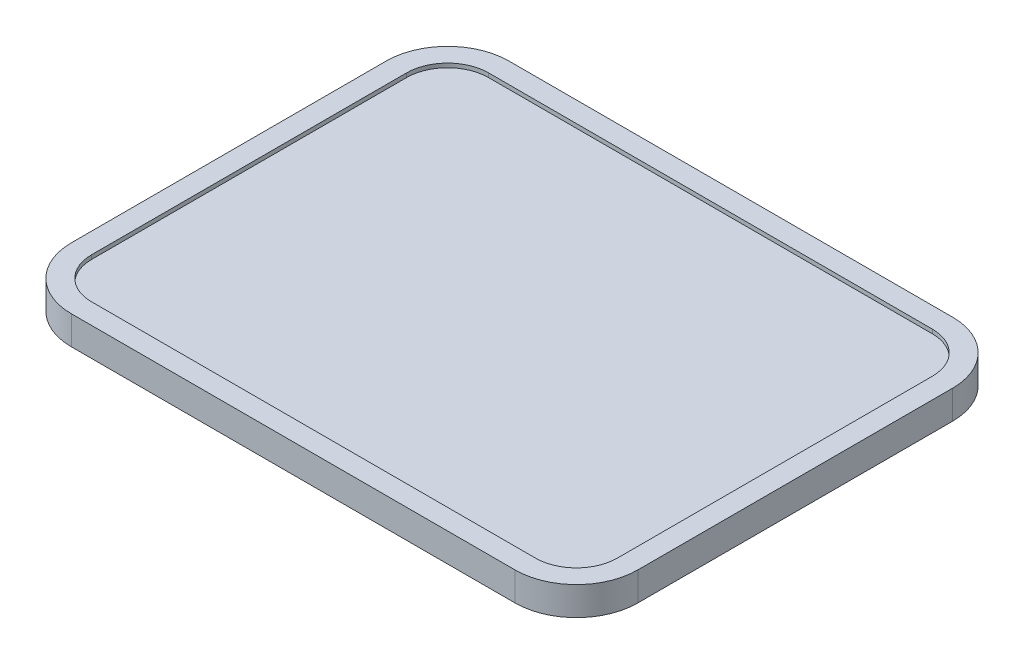
ISO-10303-21;
HEADER;
FILE_DESCRIPTION(('STEP AP214'),'2;1');
FILE_NAME('part.step','',(''),(''),'','','');
FILE_SCHEMA(('AUTOMOTIVE_DESIGN { 1 0 10303 214 1 1 1 1 }'));
ENDSEC;
DATA;
#1=APPLICATION_CONTEXT('core data for automotive mechanical design processes');
#2=APPLICATION_PROTOCOL_DEFINITION('international standard','automotive_design',2000,#1);
#3=PRODUCT_CONTEXT('',#1,'mechanical');
#4=PRODUCT('Part','Part','',(#3));
#5=PRODUCT_RELATED_PRODUCT_CATEGORY('part','',(#4));
#6=PRODUCT_DEFINITION_FORMATION('','',#4);
#7=PRODUCT_DEFINITION_CONTEXT('part definition',#1,'design');
#8=PRODUCT_DEFINITION('design','',#6,#7);
#9=PRODUCT_DEFINITION_SHAPE('','',#8);
#10=(LENGTH_UNIT() NAMED_UNIT(*) SI_UNIT(.MILLI.,.METRE.));
#11=(NAMED_UNIT(*) PLANE_ANGLE_UNIT() SI_UNIT($,.RADIAN.));
#12=(NAMED_UNIT(*) SI_UNIT($,.STERADIAN.) SOLID_ANGLE_UNIT());
#13=UNCERTAINTY_MEASURE_WITH_UNIT(LENGTH_MEASURE(1.E-05),#10,'distance_accuracy_value','');
#14=(GEOMETRIC_REPRESENTATION_CONTEXT(3) GLOBAL_UNCERTAINTY_ASSIGNED_CONTEXT((#13)) GLOBAL_UNIT_ASSIGNED_CONTEXT((#10,
#11,#12)) REPRESENTATION_CONTEXT('',''));
#15=CARTESIAN_POINT('',(0.,0.,0.));
#16=DIRECTION('',(0.,0.,1.));
#17=DIRECTION('',(1.,0.,0.));
#18=AXIS2_PLACEMENT_3D('',#15,#16,#17);
#19=CARTESIAN_POINT('',(138.5,14.,107.));
#20=DIRECTION('',(-1.,0.,0.));
#21=DIRECTION('',(0.,0.,1.));
#22=AXIS2_PLACEMENT_3D('',#19,#20,#21);
#23=PLANE('',#22);
#24=DIRECTION('',(0.,0.,-1.));
#25=VECTOR('',#24,1.);
#26=CARTESIAN_POINT('',(138.5,0.,107.));
#27=LINE('',#26,#25);
#28=CARTESIAN_POINT('',(138.5,0.,77.));
#29=VERTEX_POINT('',#28);
#30=CARTESIAN_POINT('',(138.5,0.,-77.));
#31=VERTEX_POINT('',#30);
#32=EDGE_CURVE('E377',#29,#31,#27,.T.);
#33=ORIENTED_EDGE('',*,*,#32,.T.);
#34=DIRECTION('',(0.,-1.,0.));
#35=VECTOR('',#34,1.);
#36=CARTESIAN_POINT('',(138.5,14.,-77.));
#37=LINE('',#36,#35);
#38=CARTESIAN_POINT('',(138.5,14.,-77.));
#39=VERTEX_POINT('',#38);
#40=EDGE_CURVE('E11',#31,#39,#37,.F.);
#41=ORIENTED_EDGE('',*,*,#40,.T.);
#42=DIRECTION('',(0.,0.,-1.));
#43=VECTOR('',#42,1.);
#44=CARTESIAN_POINT('',(138.5,14.,107.));
#45=LINE('',#44,#43);
#46=CARTESIAN_POINT('',(138.5,14.,77.));
#47=VERTEX_POINT('',#46);
#48=EDGE_CURVE('E391',#47,#39,#45,.T.);
#49=ORIENTED_EDGE('',*,*,#48,.F.);
#50=DIRECTION('',(0.,-1.,0.));
#51=VECTOR('',#50,1.);
#52=CARTESIAN_POINT('',(138.5,14.,77.));
#53=LINE('',#52,#51);
#54=EDGE_CURVE('E50',#47,#29,#53,.T.);
#55=ORIENTED_EDGE('',*,*,#54,.T.);
#56=EDGE_LOOP('',(#33,#41,#49,#55));
#57=FACE_BOUND('',#56,.T.);
#58=ADVANCED_FACE('F42',(#57),#23,.F.);
#59=CARTESIAN_POINT('',(-138.5,14.,-107.));
#60=DIRECTION('',(0.,0.,1.));
#61=DIRECTION('',(1.,0.,0.));
#62=AXIS2_PLACEMENT_3D('',#59,#60,#61);
#63=PLANE('',#62);
#64=DIRECTION('',(-1.,0.,0.));
#65=VECTOR('',#64,1.);
#66=CARTESIAN_POINT('',(-138.5,0.,-107.));
#67=LINE('',#66,#65);
#68=CARTESIAN_POINT('',(108.5,0.,-107.));
#69=VERTEX_POINT('',#68);
#70=CARTESIAN_POINT('',(-108.5,0.,-107.));
#71=VERTEX_POINT('',#70);
#72=EDGE_CURVE('E407',#69,#71,#67,.T.);
#73=ORIENTED_EDGE('',*,*,#72,.T.);
#74=DIRECTION('',(0.,-1.,0.));
#75=VECTOR('',#74,1.);
#76=CARTESIAN_POINT('',(-108.5,14.,-107.));
#77=LINE('',#76,#75);
#78=CARTESIAN_POINT('',(-108.5,14.,-107.));
#79=VERTEX_POINT('',#78);
#80=EDGE_CURVE('E443',#71,#79,#77,.F.);
#81=ORIENTED_EDGE('',*,*,#80,.T.);
#82=DIRECTION('',(-1.,0.,0.));
#83=VECTOR('',#82,1.);
#84=CARTESIAN_POINT('',(-138.5,14.,-107.));
#85=LINE('',#84,#83);
#86=CARTESIAN_POINT('',(108.5,14.,-107.));
#87=VERTEX_POINT('',#86);
#88=EDGE_CURVE('E394',#87,#79,#85,.T.);
#89=ORIENTED_EDGE('',*,*,#88,.F.);
#90=DIRECTION('',(0.,-1.,0.));
#91=VECTOR('',#90,1.);
#92=CARTESIAN_POINT('',(108.5,14.,-107.));
#93=LINE('',#92,#91);
#94=EDGE_CURVE('E440',#87,#69,#93,.T.);
#95=ORIENTED_EDGE('',*,*,#94,.T.);
#96=EDGE_LOOP('',(#73,#81,#89,#95));
#97=FACE_BOUND('',#96,.T.);
#98=ADVANCED_FACE('F462',(#97),#63,.F.);
#99=CARTESIAN_POINT('',(-138.5,14.,107.));
#100=DIRECTION('',(1.,0.,0.));
#101=DIRECTION('',(0.,0.,-1.));
#102=AXIS2_PLACEMENT_3D('',#99,#100,#101);
#103=PLANE('',#102);
#104=DIRECTION('',(0.,0.,1.));
#105=VECTOR('',#104,1.);
#106=CARTESIAN_POINT('',(-138.5,0.,107.));
#107=LINE('',#106,#105);
#108=CARTESIAN_POINT('',(-138.5,0.,-77.));
#109=VERTEX_POINT('',#108);
#110=CARTESIAN_POINT('',(-138.5,0.,77.));
#111=VERTEX_POINT('',#110);
#112=EDGE_CURVE('E410',#109,#111,#107,.T.);
#113=ORIENTED_EDGE('',*,*,#112,.T.);
#114=DIRECTION('',(0.,-1.,0.));
#115=VECTOR('',#114,1.);
#116=CARTESIAN_POINT('',(-138.5,14.,77.));
#117=LINE('',#116,#115);
#118=CARTESIAN_POINT('',(-138.5,14.,77.));
#119=VERTEX_POINT('',#118);
#120=EDGE_CURVE('E430',#111,#119,#117,.F.);
#121=ORIENTED_EDGE('',*,*,#120,.T.);
#122=DIRECTION('',(0.,0.,1.));
#123=VECTOR('',#122,1.);
#124=CARTESIAN_POINT('',(-138.5,14.,107.));
#125=LINE('',#124,#123);
#126=CARTESIAN_POINT('',(-138.5,14.,-77.));
#127=VERTEX_POINT('',#126);
#128=EDGE_CURVE('E398',#127,#119,#125,.T.);
#129=ORIENTED_EDGE('',*,*,#128,.F.);
#130=DIRECTION('',(0.,-1.,0.));
#131=VECTOR('',#130,1.);
#132=CARTESIAN_POINT('',(-138.5,14.,-77.));
#133=LINE('',#132,#131);
#134=EDGE_CURVE('E427',#127,#109,#133,.T.);
#135=ORIENTED_EDGE('',*,*,#134,.T.);
#136=EDGE_LOOP('',(#113,#121,#129,#135));
#137=FACE_BOUND('',#136,.T.);
#138=ADVANCED_FACE('F473',(#137),#103,.F.);
#139=CARTESIAN_POINT('',(-138.5,14.,107.));
#140=DIRECTION('',(0.,0.,-1.));
#141=DIRECTION('',(-1.,0.,0.));
#142=AXIS2_PLACEMENT_3D('',#139,#140,#141);
#143=PLANE('',#142);
#144=DIRECTION('',(1.,0.,0.));
#145=VECTOR('',#144,1.);
#146=CARTESIAN_POINT('',(-138.5,14.,107.));
#147=LINE('',#146,#145);
#148=CARTESIAN_POINT('',(-108.5,14.,107.));
#149=VERTEX_POINT('',#148);
#150=CARTESIAN_POINT('',(108.5,14.,107.));
#151=VERTEX_POINT('',#150);
#152=EDGE_CURVE('E401',#149,#151,#147,.T.);
#153=ORIENTED_EDGE('',*,*,#152,.F.);
#154=DIRECTION('',(0.,-1.,0.));
#155=VECTOR('',#154,1.);
#156=CARTESIAN_POINT('',(-108.5,14.,107.));
#157=LINE('',#156,#155);
#158=CARTESIAN_POINT('',(-108.5,0.,107.));
#159=VERTEX_POINT('',#158);
#160=EDGE_CURVE('E416',#149,#159,#157,.T.);
#161=ORIENTED_EDGE('',*,*,#160,.T.);
#162=DIRECTION('',(1.,0.,0.));
#163=VECTOR('',#162,1.);
#164=CARTESIAN_POINT('',(-138.5,0.,107.));
#165=LINE('',#164,#163);
#166=CARTESIAN_POINT('',(108.5,0.,107.));
#167=VERTEX_POINT('',#166);
#168=EDGE_CURVE('E395',#159,#167,#165,.T.);
#169=ORIENTED_EDGE('',*,*,#168,.T.);
#170=DIRECTION('',(0.,-1.,0.));
#171=VECTOR('',#170,1.);
#172=CARTESIAN_POINT('',(108.5,14.,107.));
#173=LINE('',#172,#171);
#174=EDGE_CURVE('E404',#167,#151,#173,.F.);
#175=ORIENTED_EDGE('',*,*,#174,.T.);
#176=EDGE_LOOP('',(#153,#161,#169,#175));
#177=FACE_BOUND('',#176,.T.);
#178=ADVANCED_FACE('F481',(#177),#143,.F.);
#179=CARTESIAN_POINT('',(0.,14.,0.));
#180=DIRECTION('',(0.,-1.,0.));
#181=DIRECTION('',(0.,0.,-1.));
#182=AXIS2_PLACEMENT_3D('',#179,#180,#181);
#183=PLANE('',#182);
#184=DIRECTION('',(0.,0.,1.));
#185=VECTOR('',#184,1.);
#186=CARTESIAN_POINT('',(-128.5,14.,-77.));
#187=LINE('',#186,#185);
#188=CARTESIAN_POINT('',(-128.5,14.,-77.));
#189=VERTEX_POINT('',#188);
#190=CARTESIAN_POINT('',(-128.5,14.,77.));
#191=VERTEX_POINT('',#190);
#192=EDGE_CURVE('E355',#189,#191,#187,.T.);
#193=ORIENTED_EDGE('',*,*,#192,.F.);
#194=CARTESIAN_POINT('',(-108.5,14.,-77.));
#195=DIRECTION('',(0.,1.,0.));
#196=DIRECTION('',(0.,0.,1.));
#197=AXIS2_PLACEMENT_3D('',#194,#195,#196);
#198=CIRCLE('',#197,20.);
#199=CARTESIAN_POINT('',(-108.5,14.,-97.));
#200=VERTEX_POINT('',#199);
#201=EDGE_CURVE('E65',#200,#189,#198,.T.);
#202=ORIENTED_EDGE('',*,*,#201,.F.);
#203=DIRECTION('',(-1.,0.,0.));
#204=VECTOR('',#203,1.);
#205=CARTESIAN_POINT('',(108.5,14.,-97.));
#206=LINE('',#205,#204);
#207=CARTESIAN_POINT('',(108.5,14.,-97.));
#208=VERTEX_POINT('',#207);
#209=EDGE_CURVE('E332',#208,#200,#206,.T.);
#210=ORIENTED_EDGE('',*,*,#209,.F.);
#211=CARTESIAN_POINT('',(108.5,14.,-77.));
#212=DIRECTION('',(0.,1.,0.));
#213=DIRECTION('',(0.,0.,1.));
#214=AXIS2_PLACEMENT_3D('',#211,#212,#213);
#215=CIRCLE('',#214,20.);
#216=CARTESIAN_POINT('',(128.5,14.,-77.));
#217=VERTEX_POINT('',#216);
#218=EDGE_CURVE('E370',#217,#208,#215,.T.);
#219=ORIENTED_EDGE('',*,*,#218,.F.);
#220=DIRECTION('',(0.,0.,-1.));
#221=VECTOR('',#220,1.);
#222=CARTESIAN_POINT('',(128.5,14.,77.));
#223=LINE('',#222,#221);
#224=CARTESIAN_POINT('',(128.5,14.,77.));
#225=VERTEX_POINT('',#224);
#226=EDGE_CURVE('E367',#225,#217,#223,.T.);
#227=ORIENTED_EDGE('',*,*,#226,.F.);
#228=CARTESIAN_POINT('',(108.5,14.,77.));
#229=DIRECTION('',(0.,1.,0.));
#230=DIRECTION('',(0.,0.,1.));
#231=AXIS2_PLACEMENT_3D('',#228,#229,#230);
#232=CIRCLE('',#231,20.);
#233=CARTESIAN_POINT('',(108.5,14.,97.));
#234=VERTEX_POINT('',#233);
#235=EDGE_CURVE('E364',#234,#225,#232,.T.);
#236=ORIENTED_EDGE('',*,*,#235,.F.);
#237=DIRECTION('',(1.,0.,0.));
#238=VECTOR('',#237,1.);
#239=CARTESIAN_POINT('',(-108.5,14.,97.));
#240=LINE('',#239,#238);
#241=CARTESIAN_POINT('',(-108.5,14.,97.));
#242=VERTEX_POINT('',#241);
#243=EDGE_CURVE('E361',#242,#234,#240,.T.);
#244=ORIENTED_EDGE('',*,*,#243,.F.);
#245=CARTESIAN_POINT('',(-108.5,14.,77.));
#246=DIRECTION('',(0.,1.,0.));
#247=DIRECTION('',(0.,0.,1.));
#248=AXIS2_PLACEMENT_3D('',#245,#246,#247);
#249=CIRCLE('',#248,20.);
#250=EDGE_CURVE('E358',#191,#242,#249,.T.);
#251=ORIENTED_EDGE('',*,*,#250,.F.);
#252=EDGE_LOOP('',(#193,#202,#210,#219,#227,#236,#244,#251));
#253=FACE_BOUND('',#252,.T.);
#254=ORIENTED_EDGE('',*,*,#128,.T.);
#255=CARTESIAN_POINT('',(-108.5,14.,77.));
#256=DIRECTION('',(0.,-1.,0.));
#257=DIRECTION('',(0.,0.,-1.));
#258=AXIS2_PLACEMENT_3D('',#255,#256,#257);
#259=CIRCLE('',#258,30.);
#260=EDGE_CURVE('E438',#119,#149,#259,.F.);
#261=ORIENTED_EDGE('',*,*,#260,.T.);
#262=ORIENTED_EDGE('',*,*,#152,.T.);
#263=CARTESIAN_POINT('',(108.5,14.,77.));
#264=DIRECTION('',(0.,-1.,0.));
#265=DIRECTION('',(0.,0.,-1.));
#266=AXIS2_PLACEMENT_3D('',#263,#264,#265);
#267=CIRCLE('',#266,30.);
#268=EDGE_CURVE('E432',#151,#47,#267,.F.);
#269=ORIENTED_EDGE('',*,*,#268,.T.);
#270=ORIENTED_EDGE('',*,*,#48,.T.);
#271=CARTESIAN_POINT('',(108.5,14.,-77.));
#272=DIRECTION('',(0.,-1.,0.));
#273=DIRECTION('',(0.,0.,-1.));
#274=AXIS2_PLACEMENT_3D('',#271,#272,#273);
#275=CIRCLE('',#274,30.);
#276=EDGE_CURVE('E434',#39,#87,#275,.F.);
#277=ORIENTED_EDGE('',*,*,#276,.T.);
#278=ORIENTED_EDGE('',*,*,#88,.T.);
#279=CARTESIAN_POINT('',(-108.5,14.,-77.));
#280=DIRECTION('',(0.,-1.,0.));
#281=DIRECTION('',(0.,0.,-1.));
#282=AXIS2_PLACEMENT_3D('',#279,#280,#281);
#283=CIRCLE('',#282,30.);
#284=EDGE_CURVE('E436',#79,#127,#283,.F.);
#285=ORIENTED_EDGE('',*,*,#284,.T.);
#286=EDGE_LOOP('',(#254,#261,#262,#269,#270,#277,#278,#285));
#287=FACE_BOUND('',#286,.T.);
#288=ADVANCED_FACE('F466',(#253,#287),#183,.F.);
#289=CARTESIAN_POINT('',(0.,0.,0.));
#290=DIRECTION('',(0.,-1.,0.));
#291=DIRECTION('',(0.,0.,-1.));
#292=AXIS2_PLACEMENT_3D('',#289,#290,#291);
#293=PLANE('',#292);
#294=DIRECTION('',(-1.,0.,0.));
#295=VECTOR('',#294,1.);
#296=CARTESIAN_POINT('',(128.5,0.,77.));
#297=LINE('',#296,#295);
#298=CARTESIAN_POINT('',(128.5,0.,77.));
#299=VERTEX_POINT('',#298);
#300=CARTESIAN_POINT('',(104.5,0.,77.));
#301=VERTEX_POINT('',#300);
#302=EDGE_CURVE('E57',#299,#301,#297,.T.);
#303=ORIENTED_EDGE('',*,*,#302,.F.);
#304=DIRECTION('',(0.,0.,1.));
#305=VECTOR('',#304,1.);
#306=CARTESIAN_POINT('',(128.5,0.,0.));
#307=LINE('',#306,#305);
#308=CARTESIAN_POINT('',(128.5,0.,-77.));
#309=VERTEX_POINT('',#308);
#310=EDGE_CURVE('E247',#309,#299,#307,.T.);
#311=ORIENTED_EDGE('',*,*,#310,.F.);
#312=DIRECTION('',(1.,0.,0.));
#313=VECTOR('',#312,1.);
#314=CARTESIAN_POINT('',(128.5,0.,-77.));
#315=LINE('',#314,#313);
#316=CARTESIAN_POINT('',(104.5,0.,-77.));
#317=VERTEX_POINT('',#316);
#318=EDGE_CURVE('E250',#317,#309,#315,.T.);
#319=ORIENTED_EDGE('',*,*,#318,.F.);
#320=DIRECTION('',(0.,0.,1.));
#321=VECTOR('',#320,1.);
#322=CARTESIAN_POINT('',(104.5,0.,-77.));
#323=LINE('',#322,#321);
#324=CARTESIAN_POINT('',(104.5,0.,-96.));
#325=VERTEX_POINT('',#324);
#326=EDGE_CURVE('E302',#325,#317,#323,.T.);
#327=ORIENTED_EDGE('',*,*,#326,.F.);
#328=DIRECTION('',(1.,0.,0.));
#329=VECTOR('',#328,1.);
#330=CARTESIAN_POINT('',(-104.5,0.,-96.));
#331=LINE('',#330,#329);
#332=CARTESIAN_POINT('',(-104.5,0.,-96.));
#333=VERTEX_POINT('',#332);
#334=EDGE_CURVE('E299',#333,#325,#331,.T.);
#335=ORIENTED_EDGE('',*,*,#334,.F.);
#336=DIRECTION('',(0.,0.,-1.));
#337=VECTOR('',#336,1.);
#338=CARTESIAN_POINT('',(-104.5,0.,-77.));
#339=LINE('',#338,#337);
#340=CARTESIAN_POINT('',(-104.5,0.,-77.));
#341=VERTEX_POINT('',#340);
#342=EDGE_CURVE('E296',#341,#333,#339,.T.);
#343=ORIENTED_EDGE('',*,*,#342,.F.);
#344=DIRECTION('',(1.,0.,0.));
#345=VECTOR('',#344,1.);
#346=CARTESIAN_POINT('',(-128.5,0.,-77.));
#347=LINE('',#346,#345);
#348=CARTESIAN_POINT('',(-128.5,0.,-77.));
#349=VERTEX_POINT('',#348);
#350=EDGE_CURVE('E293',#349,#341,#347,.T.);
#351=ORIENTED_EDGE('',*,*,#350,.F.);
#352=DIRECTION('',(0.,0.,-1.));
#353=VECTOR('',#352,1.);
#354=CARTESIAN_POINT('',(-128.5,0.,-77.));
#355=LINE('',#354,#353);
#356=CARTESIAN_POINT('',(-128.5,0.,77.));
#357=VERTEX_POINT('',#356);
#358=EDGE_CURVE('E290',#357,#349,#355,.T.);
#359=ORIENTED_EDGE('',*,*,#358,.F.);
#360=DIRECTION('',(-1.,0.,0.));
#361=VECTOR('',#360,1.);
#362=CARTESIAN_POINT('',(-128.5,0.,77.));
#363=LINE('',#362,#361);
#364=CARTESIAN_POINT('',(-104.5,0.,77.));
#365=VERTEX_POINT('',#364);
#366=EDGE_CURVE('E287',#365,#357,#363,.T.);
#367=ORIENTED_EDGE('',*,*,#366,.F.);
#368=DIRECTION('',(0.,0.,-1.));
#369=VECTOR('',#368,1.);
#370=CARTESIAN_POINT('',(-104.5,0.,77.));
#371=LINE('',#370,#369);
#372=CARTESIAN_POINT('',(-104.5,0.,96.));
#373=VERTEX_POINT('',#372);
#374=EDGE_CURVE('E284',#373,#365,#371,.T.);
#375=ORIENTED_EDGE('',*,*,#374,.F.);
#376=DIRECTION('',(-1.,0.,0.));
#377=VECTOR('',#376,1.);
#378=CARTESIAN_POINT('',(-104.5,0.,96.));
#379=LINE('',#378,#377);
#380=CARTESIAN_POINT('',(104.5,0.,96.));
#381=VERTEX_POINT('',#380);
#382=EDGE_CURVE('E281',#381,#373,#379,.T.);
#383=ORIENTED_EDGE('',*,*,#382,.F.);
#384=DIRECTION('',(0.,0.,1.));
#385=VECTOR('',#384,1.);
#386=CARTESIAN_POINT('',(104.5,0.,77.));
#387=LINE('',#386,#385);
#388=EDGE_CURVE('E279',#301,#381,#387,.T.);
#389=ORIENTED_EDGE('',*,*,#388,.F.);
#390=EDGE_LOOP('',(#303,#311,#319,#327,#335,#343,#351,#359,#367,#375,#383,#389));
#391=FACE_BOUND('',#390,.T.);
#392=ORIENTED_EDGE('',*,*,#168,.F.);
#393=CARTESIAN_POINT('',(-108.5,0.,77.));
#394=DIRECTION('',(0.,-1.,0.));
#395=DIRECTION('',(0.,0.,-1.));
#396=AXIS2_PLACEMENT_3D('',#393,#394,#395);
#397=CIRCLE('',#396,30.);
#398=EDGE_CURVE('E425',#159,#111,#397,.T.);
#399=ORIENTED_EDGE('',*,*,#398,.T.);
#400=ORIENTED_EDGE('',*,*,#112,.F.);
#401=CARTESIAN_POINT('',(-108.5,0.,-77.));
#402=DIRECTION('',(0.,-1.,0.));
#403=DIRECTION('',(0.,0.,-1.));
#404=AXIS2_PLACEMENT_3D('',#401,#402,#403);
#405=CIRCLE('',#404,30.);
#406=EDGE_CURVE('E423',#109,#71,#405,.T.);
#407=ORIENTED_EDGE('',*,*,#406,.T.);
#408=ORIENTED_EDGE('',*,*,#72,.F.);
#409=CARTESIAN_POINT('',(108.5,0.,-77.));
#410=DIRECTION('',(0.,-1.,0.));
#411=DIRECTION('',(0.,0.,-1.));
#412=AXIS2_PLACEMENT_3D('',#409,#410,#411);
#413=CIRCLE('',#412,30.);
#414=EDGE_CURVE('E421',#69,#31,#413,.T.);
#415=ORIENTED_EDGE('',*,*,#414,.T.);
#416=ORIENTED_EDGE('',*,*,#32,.F.);
#417=CARTESIAN_POINT('',(108.5,0.,77.));
#418=DIRECTION('',(0.,-1.,0.));
#419=DIRECTION('',(0.,0.,-1.));
#420=AXIS2_PLACEMENT_3D('',#417,#418,#419);
#421=CIRCLE('',#420,30.);
#422=EDGE_CURVE('E419',#29,#167,#421,.T.);
#423=ORIENTED_EDGE('',*,*,#422,.T.);
#424=EDGE_LOOP('',(#392,#399,#400,#407,#408,#415,#416,#423));
#425=FACE_BOUND('',#424,.T.);
#426=ADVANCED_FACE('F454',(#391,#425),#293,.T.);
#427=CARTESIAN_POINT('',(-108.5,14.,77.));
#428=DIRECTION('',(0.,-1.,0.));
#429=DIRECTION('',(0.,0.,-1.));
#430=AXIS2_PLACEMENT_3D('',#427,#428,#429);
#431=CYLINDRICAL_SURFACE('',#430,30.);
#432=ORIENTED_EDGE('',*,*,#260,.F.);
#433=ORIENTED_EDGE('',*,*,#120,.F.);
#434=ORIENTED_EDGE('',*,*,#398,.F.);
#435=ORIENTED_EDGE('',*,*,#160,.F.);
#436=EDGE_LOOP('',(#432,#433,#434,#435));
#437=FACE_BOUND('',#436,.T.);
#438=ADVANCED_FACE('F478',(#437),#431,.T.);
#439=CARTESIAN_POINT('',(-108.5,14.,-77.));
#440=DIRECTION('',(0.,-1.,0.));
#441=DIRECTION('',(0.,0.,-1.));
#442=AXIS2_PLACEMENT_3D('',#439,#440,#441);
#443=CYLINDRICAL_SURFACE('',#442,30.);
#444=ORIENTED_EDGE('',*,*,#284,.F.);
#445=ORIENTED_EDGE('',*,*,#80,.F.);
#446=ORIENTED_EDGE('',*,*,#406,.F.);
#447=ORIENTED_EDGE('',*,*,#134,.F.);
#448=EDGE_LOOP('',(#444,#445,#446,#447));
#449=FACE_BOUND('',#448,.T.);
#450=ADVANCED_FACE('F470',(#449),#443,.T.);
#451=CARTESIAN_POINT('',(108.5,14.,-77.));
#452=DIRECTION('',(0.,-1.,0.));
#453=DIRECTION('',(0.,0.,-1.));
#454=AXIS2_PLACEMENT_3D('',#451,#452,#453);
#455=CYLINDRICAL_SURFACE('',#454,30.);
#456=ORIENTED_EDGE('',*,*,#276,.F.);
#457=ORIENTED_EDGE('',*,*,#40,.F.);
#458=ORIENTED_EDGE('',*,*,#414,.F.);
#459=ORIENTED_EDGE('',*,*,#94,.F.);
#460=EDGE_LOOP('',(#456,#457,#458,#459));
#461=FACE_BOUND('',#460,.T.);
#462=ADVANCED_FACE('F459',(#461),#455,.T.);
#463=CARTESIAN_POINT('',(108.5,14.,77.));
#464=DIRECTION('',(0.,-1.,0.));
#465=DIRECTION('',(0.,0.,-1.));
#466=AXIS2_PLACEMENT_3D('',#463,#464,#465);
#467=CYLINDRICAL_SURFACE('',#466,30.);
#468=ORIENTED_EDGE('',*,*,#268,.F.);
#469=ORIENTED_EDGE('',*,*,#174,.F.);
#470=ORIENTED_EDGE('',*,*,#422,.F.);
#471=ORIENTED_EDGE('',*,*,#54,.F.);
#472=EDGE_LOOP('',(#468,#469,#470,#471));
#473=FACE_BOUND('',#472,.T.);
#474=ADVANCED_FACE('F44',(#473),#467,.T.);
#475=CARTESIAN_POINT('',(-108.5,12.,-77.));
#476=DIRECTION('',(0.,1.,0.));
#477=DIRECTION('',(0.,0.,1.));
#478=AXIS2_PLACEMENT_3D('',#475,#476,#477);
#479=CYLINDRICAL_SURFACE('',#478,20.);
#480=ORIENTED_EDGE('',*,*,#201,.T.);
#481=DIRECTION('',(0.,1.,0.));
#482=VECTOR('',#481,1.);
#483=CARTESIAN_POINT('',(-128.5,12.,-77.));
#484=LINE('',#483,#482);
#485=CARTESIAN_POINT('',(-128.5,12.,-77.));
#486=VERTEX_POINT('',#485);
#487=EDGE_CURVE('E353',#486,#189,#484,.T.);
#488=ORIENTED_EDGE('',*,*,#487,.F.);
#489=CARTESIAN_POINT('',(-108.5,12.,-77.));
#490=DIRECTION('',(0.,1.,0.));
#491=DIRECTION('',(0.,0.,1.));
#492=AXIS2_PLACEMENT_3D('',#489,#490,#491);
#493=CIRCLE('',#492,20.);
#494=CARTESIAN_POINT('',(-108.5,12.,-97.));
#495=VERTEX_POINT('',#494);
#496=EDGE_CURVE('E328',#495,#486,#493,.T.);
#497=ORIENTED_EDGE('',*,*,#496,.F.);
#498=DIRECTION('',(0.,1.,0.));
#499=VECTOR('',#498,1.);
#500=CARTESIAN_POINT('',(-108.5,12.,-97.));
#501=LINE('',#500,#499);
#502=EDGE_CURVE('E375',#495,#200,#501,.T.);
#503=ORIENTED_EDGE('',*,*,#502,.T.);
#504=EDGE_LOOP('',(#480,#488,#497,#503));
#505=FACE_BOUND('',#504,.T.);
#506=ADVANCED_FACE('F484',(#505),#479,.F.);
#507=CARTESIAN_POINT('',(108.5,12.,-97.));
#508=DIRECTION('',(0.,0.,-1.));
#509=DIRECTION('',(-1.,0.,0.));
#510=AXIS2_PLACEMENT_3D('',#507,#508,#509);
#511=PLANE('',#510);
#512=ORIENTED_EDGE('',*,*,#209,.T.);
#513=ORIENTED_EDGE('',*,*,#502,.F.);
#514=DIRECTION('',(-1.,0.,0.));
#515=VECTOR('',#514,1.);
#516=CARTESIAN_POINT('',(108.5,12.,-97.));
#517=LINE('',#516,#515);
#518=CARTESIAN_POINT('',(108.5,12.,-97.));
#519=VERTEX_POINT('',#518);
#520=EDGE_CURVE('E350',#519,#495,#517,.T.);
#521=ORIENTED_EDGE('',*,*,#520,.F.);
#522=DIRECTION('',(0.,1.,0.));
#523=VECTOR('',#522,1.);
#524=CARTESIAN_POINT('',(108.5,12.,-97.));
#525=LINE('',#524,#523);
#526=EDGE_CURVE('E378',#519,#208,#525,.T.);
#527=ORIENTED_EDGE('',*,*,#526,.T.);
#528=EDGE_LOOP('',(#512,#513,#521,#527));
#529=FACE_BOUND('',#528,.T.);
#530=ADVANCED_FACE('F490',(#529),#511,.F.);
#531=CARTESIAN_POINT('',(108.5,12.,-77.));
#532=DIRECTION('',(0.,1.,0.));
#533=DIRECTION('',(0.,0.,1.));
#534=AXIS2_PLACEMENT_3D('',#531,#532,#533);
#535=CYLINDRICAL_SURFACE('',#534,20.);
#536=ORIENTED_EDGE('',*,*,#218,.T.);
#537=ORIENTED_EDGE('',*,*,#526,.F.);
#538=CARTESIAN_POINT('',(108.5,12.,-77.));
#539=DIRECTION('',(0.,1.,0.));
#540=DIRECTION('',(0.,0.,1.));
#541=AXIS2_PLACEMENT_3D('',#538,#539,#540);
#542=CIRCLE('',#541,20.);
#543=CARTESIAN_POINT('',(128.5,12.,-77.));
#544=VERTEX_POINT('',#543);
#545=EDGE_CURVE('E347',#544,#519,#542,.T.);
#546=ORIENTED_EDGE('',*,*,#545,.F.);
#547=DIRECTION('',(0.,1.,0.));
#548=VECTOR('',#547,1.);
#549=CARTESIAN_POINT('',(128.5,12.,-77.));
#550=LINE('',#549,#548);
#551=EDGE_CURVE('E380',#544,#217,#550,.T.);
#552=ORIENTED_EDGE('',*,*,#551,.T.);
#553=EDGE_LOOP('',(#536,#537,#546,#552));
#554=FACE_BOUND('',#553,.T.);
#555=ADVANCED_FACE('F565',(#554),#535,.F.);
#556=CARTESIAN_POINT('',(128.5,12.,77.));
#557=DIRECTION('',(1.,0.,0.));
#558=DIRECTION('',(0.,0.,-1.));
#559=AXIS2_PLACEMENT_3D('',#556,#557,#558);
#560=PLANE('',#559);
#561=ORIENTED_EDGE('',*,*,#226,.T.);
#562=ORIENTED_EDGE('',*,*,#551,.F.);
#563=DIRECTION('',(0.,0.,-1.));
#564=VECTOR('',#563,1.);
#565=CARTESIAN_POINT('',(128.5,12.,77.));
#566=LINE('',#565,#564);
#567=CARTESIAN_POINT('',(128.5,12.,77.));
#568=VERTEX_POINT('',#567);
#569=EDGE_CURVE('E344',#568,#544,#566,.T.);
#570=ORIENTED_EDGE('',*,*,#569,.F.);
#571=DIRECTION('',(0.,1.,0.));
#572=VECTOR('',#571,1.);
#573=CARTESIAN_POINT('',(128.5,12.,77.));
#574=LINE('',#573,#572);
#575=EDGE_CURVE('E382',#568,#225,#574,.T.);
#576=ORIENTED_EDGE('',*,*,#575,.T.);
#577=EDGE_LOOP('',(#561,#562,#570,#576));
#578=FACE_BOUND('',#577,.T.);
#579=ADVANCED_FACE('F556',(#578),#560,.F.);
#580=CARTESIAN_POINT('',(108.5,12.,77.));
#581=DIRECTION('',(0.,1.,0.));
#582=DIRECTION('',(0.,0.,1.));
#583=AXIS2_PLACEMENT_3D('',#580,#581,#582);
#584=CYLINDRICAL_SURFACE('',#583,20.);
#585=ORIENTED_EDGE('',*,*,#235,.T.);
#586=ORIENTED_EDGE('',*,*,#575,.F.);
#587=CARTESIAN_POINT('',(108.5,12.,77.));
#588=DIRECTION('',(0.,1.,0.));
#589=DIRECTION('',(0.,0.,1.));
#590=AXIS2_PLACEMENT_3D('',#587,#588,#589);
#591=CIRCLE('',#590,20.);
#592=CARTESIAN_POINT('',(108.5,12.,97.));
#593=VERTEX_POINT('',#592);
#594=EDGE_CURVE('E341',#593,#568,#591,.T.);
#595=ORIENTED_EDGE('',*,*,#594,.F.);
#596=DIRECTION('',(0.,1.,0.));
#597=VECTOR('',#596,1.);
#598=CARTESIAN_POINT('',(108.5,12.,97.));
#599=LINE('',#598,#597);
#600=EDGE_CURVE('E384',#593,#234,#599,.T.);
#601=ORIENTED_EDGE('',*,*,#600,.T.);
#602=EDGE_LOOP('',(#585,#586,#595,#601));
#603=FACE_BOUND('',#602,.T.);
#604=ADVANCED_FACE('F551',(#603),#584,.F.);
#605=CARTESIAN_POINT('',(-108.5,12.,97.));
#606=DIRECTION('',(0.,0.,1.));
#607=DIRECTION('',(1.,0.,0.));
#608=AXIS2_PLACEMENT_3D('',#605,#606,#607);
#609=PLANE('',#608);
#610=ORIENTED_EDGE('',*,*,#243,.T.);
#611=ORIENTED_EDGE('',*,*,#600,.F.);
#612=DIRECTION('',(1.,0.,0.));
#613=VECTOR('',#612,1.);
#614=CARTESIAN_POINT('',(-108.5,12.,97.));
#615=LINE('',#614,#613);
#616=CARTESIAN_POINT('',(-108.5,12.,97.));
#617=VERTEX_POINT('',#616);
#618=EDGE_CURVE('E338',#617,#593,#615,.T.);
#619=ORIENTED_EDGE('',*,*,#618,.F.);
#620=DIRECTION('',(0.,1.,0.));
#621=VECTOR('',#620,1.);
#622=CARTESIAN_POINT('',(-108.5,12.,97.));
#623=LINE('',#622,#621);
#624=EDGE_CURVE('E386',#617,#242,#623,.T.);
#625=ORIENTED_EDGE('',*,*,#624,.T.);
#626=EDGE_LOOP('',(#610,#611,#619,#625));
#627=FACE_BOUND('',#626,.T.);
#628=ADVANCED_FACE('F555',(#627),#609,.F.);
#629=CARTESIAN_POINT('',(-108.5,12.,77.));
#630=DIRECTION('',(0.,1.,0.));
#631=DIRECTION('',(0.,0.,1.));
#632=AXIS2_PLACEMENT_3D('',#629,#630,#631);
#633=CYLINDRICAL_SURFACE('',#632,20.);
#634=ORIENTED_EDGE('',*,*,#250,.T.);
#635=ORIENTED_EDGE('',*,*,#624,.F.);
#636=CARTESIAN_POINT('',(-108.5,12.,77.));
#637=DIRECTION('',(0.,1.,0.));
#638=DIRECTION('',(0.,0.,1.));
#639=AXIS2_PLACEMENT_3D('',#636,#637,#638);
#640=CIRCLE('',#639,20.);
#641=CARTESIAN_POINT('',(-128.5,12.,77.));
#642=VERTEX_POINT('',#641);
#643=EDGE_CURVE('E335',#642,#617,#640,.T.);
#644=ORIENTED_EDGE('',*,*,#643,.F.);
#645=DIRECTION('',(0.,1.,0.));
#646=VECTOR('',#645,1.);
#647=CARTESIAN_POINT('',(-128.5,12.,77.));
#648=LINE('',#647,#646);
#649=EDGE_CURVE('E388',#642,#191,#648,.T.);
#650=ORIENTED_EDGE('',*,*,#649,.T.);
#651=EDGE_LOOP('',(#634,#635,#644,#650));
#652=FACE_BOUND('',#651,.T.);
#653=ADVANCED_FACE('F573',(#652),#633,.F.);
#654=CARTESIAN_POINT('',(-128.5,12.,-77.));
#655=DIRECTION('',(-1.,0.,0.));
#656=DIRECTION('',(0.,0.,1.));
#657=AXIS2_PLACEMENT_3D('',#654,#655,#656);
#658=PLANE('',#657);
#659=ORIENTED_EDGE('',*,*,#192,.T.);
#660=ORIENTED_EDGE('',*,*,#649,.F.);
#661=DIRECTION('',(0.,0.,1.));
#662=VECTOR('',#661,1.);
#663=CARTESIAN_POINT('',(-128.5,12.,-77.));
#664=LINE('',#663,#662);
#665=EDGE_CURVE('E331',#486,#642,#664,.T.);
#666=ORIENTED_EDGE('',*,*,#665,.F.);
#667=ORIENTED_EDGE('',*,*,#487,.T.);
#668=EDGE_LOOP('',(#659,#660,#666,#667));
#669=FACE_BOUND('',#668,.T.);
#670=ADVANCED_FACE('F592',(#669),#658,.F.);
#671=CARTESIAN_POINT('',(-108.5,12.,-77.));
#672=DIRECTION('',(0.,1.,0.));
#673=DIRECTION('',(0.,0.,1.));
#674=AXIS2_PLACEMENT_3D('',#671,#672,#673);
#675=PLANE('',#674);
#676=ORIENTED_EDGE('',*,*,#496,.T.);
#677=ORIENTED_EDGE('',*,*,#665,.T.);
#678=ORIENTED_EDGE('',*,*,#643,.T.);
#679=ORIENTED_EDGE('',*,*,#618,.T.);
#680=ORIENTED_EDGE('',*,*,#594,.T.);
#681=ORIENTED_EDGE('',*,*,#569,.T.);
#682=ORIENTED_EDGE('',*,*,#545,.T.);
#683=ORIENTED_EDGE('',*,*,#520,.T.);
#684=EDGE_LOOP('',(#676,#677,#678,#679,#680,#681,#682,#683));
#685=FACE_BOUND('',#684,.T.);
#686=ADVANCED_FACE('F595',(#685),#675,.T.);
#687=CARTESIAN_POINT('',(128.5,2.,77.));
#688=DIRECTION('',(0.,0.,1.));
#689=DIRECTION('',(1.,0.,0.));
#690=AXIS2_PLACEMENT_3D('',#687,#688,#689);
#691=PLANE('',#690);
#692=ORIENTED_EDGE('',*,*,#302,.T.);
#693=DIRECTION('',(0.,-1.,0.));
#694=VECTOR('',#693,1.);
#695=CARTESIAN_POINT('',(104.5,2.,77.));
#696=LINE('',#695,#694);
#697=CARTESIAN_POINT('',(104.5,2.,77.));
#698=VERTEX_POINT('',#697);
#699=EDGE_CURVE('E224',#698,#301,#696,.T.);
#700=ORIENTED_EDGE('',*,*,#699,.F.);
#701=DIRECTION('',(-1.,0.,0.));
#702=VECTOR('',#701,1.);
#703=CARTESIAN_POINT('',(128.5,2.,77.));
#704=LINE('',#703,#702);
#705=CARTESIAN_POINT('',(128.5,2.,77.));
#706=VERTEX_POINT('',#705);
#707=EDGE_CURVE('E228',#706,#698,#704,.T.);
#708=ORIENTED_EDGE('',*,*,#707,.F.);
#709=DIRECTION('',(0.,-1.,0.));
#710=VECTOR('',#709,1.);
#711=CARTESIAN_POINT('',(128.5,2.,77.));
#712=LINE('',#711,#710);
#713=EDGE_CURVE('E307',#706,#299,#712,.T.);
#714=ORIENTED_EDGE('',*,*,#713,.T.);
#715=EDGE_LOOP('',(#692,#700,#708,#714));
#716=FACE_BOUND('',#715,.T.);
#717=ADVANCED_FACE('F226',(#716),#691,.F.);
#718=CARTESIAN_POINT('',(128.5,2.,0.));
#719=DIRECTION('',(1.,0.,0.));
#720=DIRECTION('',(0.,0.,-1.));
#721=AXIS2_PLACEMENT_3D('',#718,#719,#720);
#722=PLANE('',#721);
#723=ORIENTED_EDGE('',*,*,#310,.T.);
#724=ORIENTED_EDGE('',*,*,#713,.F.);
#725=DIRECTION('',(0.,0.,1.));
#726=VECTOR('',#725,1.);
#727=CARTESIAN_POINT('',(128.5,2.,0.));
#728=LINE('',#727,#726);
#729=CARTESIAN_POINT('',(128.5,2.,-77.));
#730=VERTEX_POINT('',#729);
#731=EDGE_CURVE('E233',#730,#706,#728,.T.);
#732=ORIENTED_EDGE('',*,*,#731,.F.);
#733=DIRECTION('',(0.,-1.,0.));
#734=VECTOR('',#733,1.);
#735=CARTESIAN_POINT('',(128.5,2.,-77.));
#736=LINE('',#735,#734);
#737=EDGE_CURVE('E309',#730,#309,#736,.T.);
#738=ORIENTED_EDGE('',*,*,#737,.T.);
#739=EDGE_LOOP('',(#723,#724,#732,#738));
#740=FACE_BOUND('',#739,.T.);
#741=ADVANCED_FACE('F636',(#740),#722,.F.);
#742=CARTESIAN_POINT('',(128.5,2.,-77.));
#743=DIRECTION('',(0.,0.,-1.));
#744=DIRECTION('',(-1.,0.,0.));
#745=AXIS2_PLACEMENT_3D('',#742,#743,#744);
#746=PLANE('',#745);
#747=ORIENTED_EDGE('',*,*,#318,.T.);
#748=ORIENTED_EDGE('',*,*,#737,.F.);
#749=DIRECTION('',(1.,0.,0.));
#750=VECTOR('',#749,1.);
#751=CARTESIAN_POINT('',(128.5,2.,-77.));
#752=LINE('',#751,#750);
#753=CARTESIAN_POINT('',(104.5,2.,-77.));
#754=VERTEX_POINT('',#753);
#755=EDGE_CURVE('E275',#754,#730,#752,.T.);
#756=ORIENTED_EDGE('',*,*,#755,.F.);
#757=DIRECTION('',(0.,-1.,0.));
#758=VECTOR('',#757,1.);
#759=CARTESIAN_POINT('',(104.5,2.,-77.));
#760=LINE('',#759,#758);
#761=EDGE_CURVE('E311',#754,#317,#760,.T.);
#762=ORIENTED_EDGE('',*,*,#761,.T.);
#763=EDGE_LOOP('',(#747,#748,#756,#762));
#764=FACE_BOUND('',#763,.T.);
#765=ADVANCED_FACE('F647',(#764),#746,.F.);
#766=CARTESIAN_POINT('',(104.5,2.,-77.));
#767=DIRECTION('',(1.,0.,0.));
#768=DIRECTION('',(0.,0.,-1.));
#769=AXIS2_PLACEMENT_3D('',#766,#767,#768);
#770=PLANE('',#769);
#771=ORIENTED_EDGE('',*,*,#326,.T.);
#772=ORIENTED_EDGE('',*,*,#761,.F.);
#773=DIRECTION('',(0.,0.,1.));
#774=VECTOR('',#773,1.);
#775=CARTESIAN_POINT('',(104.5,2.,-77.));
#776=LINE('',#775,#774);
#777=CARTESIAN_POINT('',(104.5,2.,-96.));
#778=VERTEX_POINT('',#777);
#779=EDGE_CURVE('E272',#778,#754,#776,.T.);
#780=ORIENTED_EDGE('',*,*,#779,.F.);
#781=DIRECTION('',(0.,-1.,0.));
#782=VECTOR('',#781,1.);
#783=CARTESIAN_POINT('',(104.5,2.,-96.));
#784=LINE('',#783,#782);
#785=EDGE_CURVE('E313',#778,#325,#784,.T.);
#786=ORIENTED_EDGE('',*,*,#785,.T.);
#787=EDGE_LOOP('',(#771,#772,#780,#786));
#788=FACE_BOUND('',#787,.T.);
#789=ADVANCED_FACE('F657',(#788),#770,.F.);
#790=CARTESIAN_POINT('',(-104.5,2.,-96.));
#791=DIRECTION('',(0.,0.,-1.));
#792=DIRECTION('',(-1.,0.,0.));
#793=AXIS2_PLACEMENT_3D('',#790,#791,#792);
#794=PLANE('',#793);
#795=ORIENTED_EDGE('',*,*,#334,.T.);
#796=ORIENTED_EDGE('',*,*,#785,.F.);
#797=DIRECTION('',(1.,0.,0.));
#798=VECTOR('',#797,1.);
#799=CARTESIAN_POINT('',(-104.5,2.,-96.));
#800=LINE('',#799,#798);
#801=CARTESIAN_POINT('',(-104.5,2.,-96.));
#802=VERTEX_POINT('',#801);
#803=EDGE_CURVE('E269',#802,#778,#800,.T.);
#804=ORIENTED_EDGE('',*,*,#803,.F.);
#805=DIRECTION('',(0.,-1.,0.));
#806=VECTOR('',#805,1.);
#807=CARTESIAN_POINT('',(-104.5,2.,-96.));
#808=LINE('',#807,#806);
#809=EDGE_CURVE('E315',#802,#333,#808,.T.);
#810=ORIENTED_EDGE('',*,*,#809,.T.);
#811=EDGE_LOOP('',(#795,#796,#804,#810));
#812=FACE_BOUND('',#811,.T.);
#813=ADVANCED_FACE('F668',(#812),#794,.F.);
#814=CARTESIAN_POINT('',(-104.5,2.,-77.));
#815=DIRECTION('',(-1.,0.,0.));
#816=DIRECTION('',(0.,0.,1.));
#817=AXIS2_PLACEMENT_3D('',#814,#815,#816);
#818=PLANE('',#817);
#819=ORIENTED_EDGE('',*,*,#342,.T.);
#820=ORIENTED_EDGE('',*,*,#809,.F.);
#821=DIRECTION('',(0.,0.,-1.));
#822=VECTOR('',#821,1.);
#823=CARTESIAN_POINT('',(-104.5,2.,-77.));
#824=LINE('',#823,#822);
#825=CARTESIAN_POINT('',(-104.5,2.,-77.));
#826=VERTEX_POINT('',#825);
#827=EDGE_CURVE('E266',#826,#802,#824,.T.);
#828=ORIENTED_EDGE('',*,*,#827,.F.);
#829=DIRECTION('',(0.,-1.,0.));
#830=VECTOR('',#829,1.);
#831=CARTESIAN_POINT('',(-104.5,2.,-77.));
#832=LINE('',#831,#830);
#833=EDGE_CURVE('E317',#826,#341,#832,.T.);
#834=ORIENTED_EDGE('',*,*,#833,.T.);
#835=EDGE_LOOP('',(#819,#820,#828,#834));
#836=FACE_BOUND('',#835,.T.);
#837=ADVANCED_FACE('F679',(#836),#818,.F.);
#838=CARTESIAN_POINT('',(-128.5,2.,-77.));
#839=DIRECTION('',(0.,0.,-1.));
#840=DIRECTION('',(-1.,0.,0.));
#841=AXIS2_PLACEMENT_3D('',#838,#839,#840);
#842=PLANE('',#841);
#843=ORIENTED_EDGE('',*,*,#350,.T.);
#844=ORIENTED_EDGE('',*,*,#833,.F.);
#845=DIRECTION('',(1.,0.,0.));
#846=VECTOR('',#845,1.);
#847=CARTESIAN_POINT('',(-128.5,2.,-77.));
#848=LINE('',#847,#846);
#849=CARTESIAN_POINT('',(-128.5,2.,-77.));
#850=VERTEX_POINT('',#849);
#851=EDGE_CURVE('E263',#850,#826,#848,.T.);
#852=ORIENTED_EDGE('',*,*,#851,.F.);
#853=DIRECTION('',(0.,-1.,0.));
#854=VECTOR('',#853,1.);
#855=CARTESIAN_POINT('',(-128.5,2.,-77.));
#856=LINE('',#855,#854);
#857=EDGE_CURVE('E319',#850,#349,#856,.T.);
#858=ORIENTED_EDGE('',*,*,#857,.T.);
#859=EDGE_LOOP('',(#843,#844,#852,#858));
#860=FACE_BOUND('',#859,.T.);
#861=ADVANCED_FACE('F690',(#860),#842,.F.);
#862=CARTESIAN_POINT('',(-128.5,2.,-77.));
#863=DIRECTION('',(-1.,0.,0.));
#864=DIRECTION('',(0.,0.,1.));
#865=AXIS2_PLACEMENT_3D('',#862,#863,#864);
#866=PLANE('',#865);
#867=ORIENTED_EDGE('',*,*,#358,.T.);
#868=ORIENTED_EDGE('',*,*,#857,.F.);
#869=DIRECTION('',(0.,0.,-1.));
#870=VECTOR('',#869,1.);
#871=CARTESIAN_POINT('',(-128.5,2.,-77.));
#872=LINE('',#871,#870);
#873=CARTESIAN_POINT('',(-128.5,2.,77.));
#874=VERTEX_POINT('',#873);
#875=EDGE_CURVE('E260',#874,#850,#872,.T.);
#876=ORIENTED_EDGE('',*,*,#875,.F.);
#877=DIRECTION('',(0.,-1.,0.));
#878=VECTOR('',#877,1.);
#879=CARTESIAN_POINT('',(-128.5,2.,77.));
#880=LINE('',#879,#878);
#881=EDGE_CURVE('E321',#874,#357,#880,.T.);
#882=ORIENTED_EDGE('',*,*,#881,.T.);
#883=EDGE_LOOP('',(#867,#868,#876,#882));
#884=FACE_BOUND('',#883,.T.);
#885=ADVANCED_FACE('F701',(#884),#866,.F.);
#886=CARTESIAN_POINT('',(-128.5,2.,77.));
#887=DIRECTION('',(0.,0.,1.));
#888=DIRECTION('',(1.,0.,0.));
#889=AXIS2_PLACEMENT_3D('',#886,#887,#888);
#890=PLANE('',#889);
#891=ORIENTED_EDGE('',*,*,#366,.T.);
#892=ORIENTED_EDGE('',*,*,#881,.F.);
#893=DIRECTION('',(-1.,0.,0.));
#894=VECTOR('',#893,1.);
#895=CARTESIAN_POINT('',(-128.5,2.,77.));
#896=LINE('',#895,#894);
#897=CARTESIAN_POINT('',(-104.5,2.,77.));
#898=VERTEX_POINT('',#897);
#899=EDGE_CURVE('E257',#898,#874,#896,.T.);
#900=ORIENTED_EDGE('',*,*,#899,.F.);
#901=DIRECTION('',(0.,-1.,0.));
#902=VECTOR('',#901,1.);
#903=CARTESIAN_POINT('',(-104.5,2.,77.));
#904=LINE('',#903,#902);
#905=EDGE_CURVE('E323',#898,#365,#904,.T.);
#906=ORIENTED_EDGE('',*,*,#905,.T.);
#907=EDGE_LOOP('',(#891,#892,#900,#906));
#908=FACE_BOUND('',#907,.T.);
#909=ADVANCED_FACE('F712',(#908),#890,.F.);
#910=CARTESIAN_POINT('',(-104.5,2.,77.));
#911=DIRECTION('',(-1.,0.,0.));
#912=DIRECTION('',(0.,0.,1.));
#913=AXIS2_PLACEMENT_3D('',#910,#911,#912);
#914=PLANE('',#913);
#915=ORIENTED_EDGE('',*,*,#374,.T.);
#916=ORIENTED_EDGE('',*,*,#905,.F.);
#917=DIRECTION('',(0.,0.,-1.));
#918=VECTOR('',#917,1.);
#919=CARTESIAN_POINT('',(-104.5,2.,77.));
#920=LINE('',#919,#918);
#921=CARTESIAN_POINT('',(-104.5,2.,96.));
#922=VERTEX_POINT('',#921);
#923=EDGE_CURVE('E254',#922,#898,#920,.T.);
#924=ORIENTED_EDGE('',*,*,#923,.F.);
#925=DIRECTION('',(0.,-1.,0.));
#926=VECTOR('',#925,1.);
#927=CARTESIAN_POINT('',(-104.5,2.,96.));
#928=LINE('',#927,#926);
#929=EDGE_CURVE('E325',#922,#373,#928,.T.);
#930=ORIENTED_EDGE('',*,*,#929,.T.);
#931=EDGE_LOOP('',(#915,#916,#924,#930));
#932=FACE_BOUND('',#931,.T.);
#933=ADVANCED_FACE('F723',(#932),#914,.F.);
#934=CARTESIAN_POINT('',(-104.5,2.,96.));
#935=DIRECTION('',(0.,0.,1.));
#936=DIRECTION('',(1.,0.,0.));
#937=AXIS2_PLACEMENT_3D('',#934,#935,#936);
#938=PLANE('',#937);
#939=ORIENTED_EDGE('',*,*,#382,.T.);
#940=ORIENTED_EDGE('',*,*,#929,.F.);
#941=DIRECTION('',(-1.,0.,0.));
#942=VECTOR('',#941,1.);
#943=CARTESIAN_POINT('',(-104.5,2.,96.));
#944=LINE('',#943,#942);
#945=CARTESIAN_POINT('',(104.5,2.,96.));
#946=VERTEX_POINT('',#945);
#947=EDGE_CURVE('E241',#946,#922,#944,.T.);
#948=ORIENTED_EDGE('',*,*,#947,.F.);
#949=DIRECTION('',(0.,-1.,0.));
#950=VECTOR('',#949,1.);
#951=CARTESIAN_POINT('',(104.5,2.,96.));
#952=LINE('',#951,#950);
#953=EDGE_CURVE('E232',#946,#381,#952,.T.);
#954=ORIENTED_EDGE('',*,*,#953,.T.);
#955=EDGE_LOOP('',(#939,#940,#948,#954));
#956=FACE_BOUND('',#955,.T.);
#957=ADVANCED_FACE('F734',(#956),#938,.F.);
#958=CARTESIAN_POINT('',(104.5,2.,77.));
#959=DIRECTION('',(1.,0.,0.));
#960=DIRECTION('',(0.,0.,-1.));
#961=AXIS2_PLACEMENT_3D('',#958,#959,#960);
#962=PLANE('',#961);
#963=ORIENTED_EDGE('',*,*,#388,.T.);
#964=ORIENTED_EDGE('',*,*,#953,.F.);
#965=DIRECTION('',(0.,0.,1.));
#966=VECTOR('',#965,1.);
#967=CARTESIAN_POINT('',(104.5,2.,77.));
#968=LINE('',#967,#966);
#969=EDGE_CURVE('E236',#698,#946,#968,.T.);
#970=ORIENTED_EDGE('',*,*,#969,.F.);
#971=ORIENTED_EDGE('',*,*,#699,.T.);
#972=EDGE_LOOP('',(#963,#964,#970,#971));
#973=FACE_BOUND('',#972,.T.);
#974=ADVANCED_FACE('F237',(#973),#962,.F.);
#975=CARTESIAN_POINT('',(0.,2.,0.));
#976=DIRECTION('',(0.,1.,0.));
#977=DIRECTION('',(0.,0.,1.));
#978=AXIS2_PLACEMENT_3D('',#975,#976,#977);
#979=PLANE('',#978);
#980=ORIENTED_EDGE('',*,*,#707,.T.);
#981=ORIENTED_EDGE('',*,*,#969,.T.);
#982=ORIENTED_EDGE('',*,*,#947,.T.);
#983=ORIENTED_EDGE('',*,*,#923,.T.);
#984=ORIENTED_EDGE('',*,*,#899,.T.);
#985=ORIENTED_EDGE('',*,*,#875,.T.);
#986=ORIENTED_EDGE('',*,*,#851,.T.);
#987=ORIENTED_EDGE('',*,*,#827,.T.);
#988=ORIENTED_EDGE('',*,*,#803,.T.);
#989=ORIENTED_EDGE('',*,*,#779,.T.);
#990=ORIENTED_EDGE('',*,*,#755,.T.);
#991=ORIENTED_EDGE('',*,*,#731,.T.);
#992=EDGE_LOOP('',(#980,#981,#982,#983,#984,#985,#986,#987,#988,#989,#990,#991));
#993=FACE_BOUND('',#992,.T.);
#994=ADVANCED_FACE('F243',(#993),#979,.F.);
#995=CLOSED_SHELL('',(#58,#98,#138,#178,#288,#426,#438,#450,#462,#474,#506,#530,#555,#579,#604,
#628,#653,#670,#686,#717,#741,#765,#789,#813,#837,#861,#885,#909,#933,#957,#974,#994));
#996=MANIFOLD_SOLID_BREP('B2',#995);
#997=ADVANCED_BREP_SHAPE_REPRESENTATION('',(#18,#996),#14);
#998=SHAPE_DEFINITION_REPRESENTATION(#9,#997);
ENDSEC;
END-ISO-10303-21;
